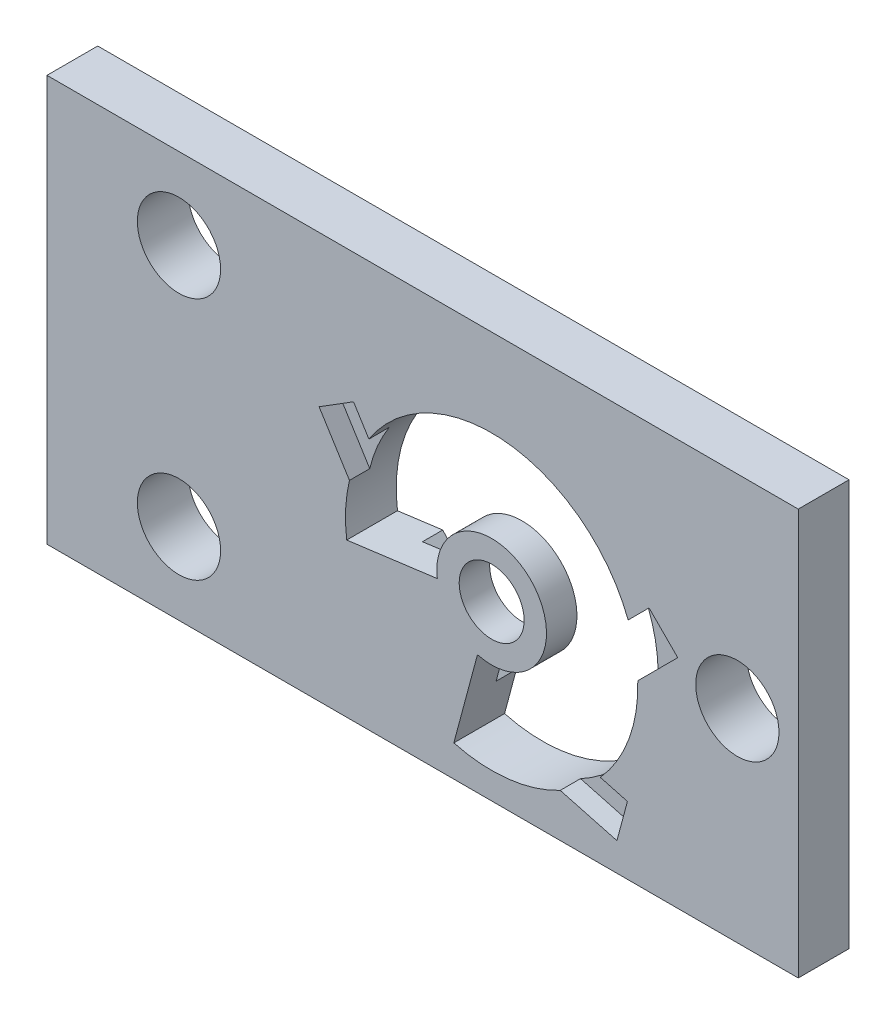
ISO-10303-21;
HEADER;
FILE_DESCRIPTION(('STEP AP214'),'2;1');
FILE_NAME('part.step','',(''),(''),'','','');
FILE_SCHEMA(('AUTOMOTIVE_DESIGN { 1 0 10303 214 1 1 1 1 }'));
ENDSEC;
DATA;
#1=APPLICATION_CONTEXT('core data for automotive mechanical design processes');
#2=APPLICATION_PROTOCOL_DEFINITION('international standard','automotive_design',2000,#1);
#3=PRODUCT_CONTEXT('',#1,'mechanical');
#4=PRODUCT('Part','Part','',(#3));
#5=PRODUCT_RELATED_PRODUCT_CATEGORY('part','',(#4));
#6=PRODUCT_DEFINITION_FORMATION('','',#4);
#7=PRODUCT_DEFINITION_CONTEXT('part definition',#1,'design');
#8=PRODUCT_DEFINITION('design','',#6,#7);
#9=PRODUCT_DEFINITION_SHAPE('','',#8);
#10=(LENGTH_UNIT() NAMED_UNIT(*) SI_UNIT(.MILLI.,.METRE.));
#11=(NAMED_UNIT(*) PLANE_ANGLE_UNIT() SI_UNIT($,.RADIAN.));
#12=(NAMED_UNIT(*) SI_UNIT($,.STERADIAN.) SOLID_ANGLE_UNIT());
#13=UNCERTAINTY_MEASURE_WITH_UNIT(LENGTH_MEASURE(1.E-05),#10,'distance_accuracy_value','');
#14=(GEOMETRIC_REPRESENTATION_CONTEXT(3) GLOBAL_UNCERTAINTY_ASSIGNED_CONTEXT((#13)) GLOBAL_UNIT_ASSIGNED_CONTEXT((#10,
#11,#12)) REPRESENTATION_CONTEXT('',''));
#15=CARTESIAN_POINT('',(0.,0.,0.));
#16=DIRECTION('',(0.,0.,1.));
#17=DIRECTION('',(1.,0.,0.));
#18=AXIS2_PLACEMENT_3D('',#15,#16,#17);
#19=CARTESIAN_POINT('',(3.4,-1.5,2.5));
#20=DIRECTION('',(0.,0.,-1.));
#21=DIRECTION('',(-1.,0.,0.));
#22=AXIS2_PLACEMENT_3D('',#19,#20,#21);
#23=CYLINDRICAL_SURFACE('',#22,1.6);
#24=CARTESIAN_POINT('',(3.4,-1.5,2.5));
#25=DIRECTION('',(0.,0.,1.));
#26=DIRECTION('',(1.,0.,0.));
#27=AXIS2_PLACEMENT_3D('',#24,#25,#26);
#28=CIRCLE('',#27,1.6);
#29=CARTESIAN_POINT('',(4.99999999999999,-1.5,2.5));
#30=VERTEX_POINT('',#29);
#31=EDGE_CURVE('E283',#30,#30,#28,.T.);
#32=ORIENTED_EDGE('',*,*,#31,.T.);
#33=EDGE_LOOP('',(#32));
#34=FACE_BOUND('',#33,.T.);
#35=CARTESIAN_POINT('',(3.4,-1.5,1.));
#36=DIRECTION('',(0.,0.,-1.));
#37=DIRECTION('',(-1.,0.,0.));
#38=AXIS2_PLACEMENT_3D('',#35,#36,#37);
#39=CIRCLE('',#38,1.6);
#40=CARTESIAN_POINT('',(1.79999999999999,-1.5,1.));
#41=VERTEX_POINT('',#40);
#42=EDGE_CURVE('E267',#41,#41,#39,.F.);
#43=ORIENTED_EDGE('',*,*,#42,.F.);
#44=EDGE_LOOP('',(#43));
#45=FACE_BOUND('',#44,.T.);
#46=ADVANCED_FACE('F34',(#34,#45),#23,.F.);
#47=CARTESIAN_POINT('',(3.4,-1.5,2.5));
#48=DIRECTION('',(0.,0.,-1.));
#49=DIRECTION('',(-1.,0.,0.));
#50=AXIS2_PLACEMENT_3D('',#47,#48,#49);
#51=CYLINDRICAL_SURFACE('',#50,2.7);
#52=CARTESIAN_POINT('',(3.4,-1.5,1.));
#53=DIRECTION('',(0.,0.,-1.));
#54=DIRECTION('',(-1.,0.,0.));
#55=AXIS2_PLACEMENT_3D('',#52,#53,#54);
#56=CIRCLE('',#55,2.7);
#57=CARTESIAN_POINT('',(0.72311131805391,-1.85251522586829,1.));
#58=VERTEX_POINT('',#57);
#59=CARTESIAN_POINT('',(2.70118857822319,-4.10799973098048,1.));
#60=VERTEX_POINT('',#59);
#61=EDGE_CURVE('E360',#58,#60,#56,.T.);
#62=ORIENTED_EDGE('',*,*,#61,.F.);
#63=DIRECTION('',(0.,0.,-1.));
#64=VECTOR('',#63,1.);
#65=CARTESIAN_POINT('',(0.72311131805391,-1.85251522586829,2.5));
#66=LINE('',#65,#64);
#67=CARTESIAN_POINT('',(0.72311131805391,-1.85251522586829,2.5));
#68=VERTEX_POINT('',#67);
#69=EDGE_CURVE('E349',#68,#58,#66,.T.);
#70=ORIENTED_EDGE('',*,*,#69,.F.);
#71=CARTESIAN_POINT('',(3.4,-1.5,2.5));
#72=DIRECTION('',(0.,0.,1.));
#73=DIRECTION('',(1.,0.,0.));
#74=AXIS2_PLACEMENT_3D('',#71,#72,#73);
#75=CIRCLE('',#74,2.7);
#76=CARTESIAN_POINT('',(2.70118857822319,-4.10799973098048,2.5));
#77=VERTEX_POINT('',#76);
#78=EDGE_CURVE('E318',#77,#68,#75,.T.);
#79=ORIENTED_EDGE('',*,*,#78,.F.);
#80=DIRECTION('',(0.,0.,-1.));
#81=VECTOR('',#80,1.);
#82=CARTESIAN_POINT('',(2.70118857822319,-4.10799973098048,2.5));
#83=LINE('',#82,#81);
#84=EDGE_CURVE('E352',#77,#60,#83,.T.);
#85=ORIENTED_EDGE('',*,*,#84,.T.);
#86=EDGE_LOOP('',(#62,#70,#79,#85));
#87=FACE_BOUND('',#86,.T.);
#88=ADVANCED_FACE('F407',(#87),#51,.T.);
#89=CARTESIAN_POINT('',(0.252122602840224,-1.91453898294296,2.5));
#90=DIRECTION('',(-0.130561194766033,0.991440252572623,0.));
#91=DIRECTION('',(-0.991440252572623,-0.130561194766033,0.));
#92=AXIS2_PLACEMENT_3D('',#89,#90,#91);
#93=PLANE('',#92);
#94=DIRECTION('',(0.,0.,-1.));
#95=VECTOR('',#94,1.);
#96=CARTESIAN_POINT('',(-1.50762925023449,-2.14627791409186,1.));
#97=LINE('',#96,#95);
#98=CARTESIAN_POINT('',(-1.50762925023449,-2.14627791409186,1.));
#99=VERTEX_POINT('',#98);
#100=CARTESIAN_POINT('',(-1.50762925023449,-2.14627791409186,0.));
#101=VERTEX_POINT('',#100);
#102=EDGE_CURVE('E272',#99,#101,#97,.T.);
#103=ORIENTED_EDGE('',*,*,#102,.T.);
#104=DIRECTION('',(0.991440252572623,0.130561194766033,0.));
#105=VECTOR('',#104,1.);
#106=CARTESIAN_POINT('',(0.252122602840224,-1.91453898294296,0.));
#107=LINE('',#106,#105);
#108=CARTESIAN_POINT('',(-3.73836981852289,-2.44004060231544,0.));
#109=VERTEX_POINT('',#108);
#110=EDGE_CURVE('E341',#109,#101,#107,.T.);
#111=ORIENTED_EDGE('',*,*,#110,.F.);
#112=DIRECTION('',(0.,0.,-1.));
#113=VECTOR('',#112,1.);
#114=CARTESIAN_POINT('',(-3.73836981852289,-2.44004060231544,2.5));
#115=LINE('',#114,#113);
#116=CARTESIAN_POINT('',(-3.73836981852289,-2.44004060231544,2.5));
#117=VERTEX_POINT('',#116);
#118=EDGE_CURVE('E358',#117,#109,#115,.T.);
#119=ORIENTED_EDGE('',*,*,#118,.F.);
#120=DIRECTION('',(0.991440252572623,0.130561194766033,0.));
#121=VECTOR('',#120,1.);
#122=CARTESIAN_POINT('',(0.252122602840224,-1.91453898294296,2.5));
#123=LINE('',#122,#121);
#124=EDGE_CURVE('E307',#117,#68,#123,.T.);
#125=ORIENTED_EDGE('',*,*,#124,.T.);
#126=ORIENTED_EDGE('',*,*,#69,.T.);
#127=DIRECTION('',(-0.991440252572623,-0.130561194766033,0.));
#128=VECTOR('',#127,1.);
#129=CARTESIAN_POINT('',(0.252122602840224,-1.91453898294296,1.));
#130=LINE('',#129,#128);
#131=EDGE_CURVE('E279',#58,#99,#130,.T.);
#132=ORIENTED_EDGE('',*,*,#131,.T.);
#133=EDGE_LOOP('',(#103,#111,#119,#125,#126,#132));
#134=FACE_BOUND('',#133,.T.);
#135=ADVANCED_FACE('F411',(#134),#93,.T.);
#136=CARTESIAN_POINT('',(3.4,-1.5,2.5));
#137=DIRECTION('',(0.,0.,-1.));
#138=DIRECTION('',(-1.,0.,0.));
#139=AXIS2_PLACEMENT_3D('',#136,#137,#138);
#140=CYLINDRICAL_SURFACE('',#139,7.2);
#141=CARTESIAN_POINT('',(3.4,-1.5,1.5));
#142=DIRECTION('',(0.,0.,1.));
#143=DIRECTION('',(1.,0.,0.));
#144=AXIS2_PLACEMENT_3D('',#141,#142,#143);
#145=CIRCLE('',#144,7.2);
#146=CARTESIAN_POINT('',(-3.60315234202061,0.172081718831754,1.5));
#147=VERTEX_POINT('',#146);
#148=CARTESIAN_POINT('',(-2.64448669175422,2.41205580650459,1.5));
#149=VERTEX_POINT('',#148);
#150=EDGE_CURVE('E11',#147,#149,#145,.F.);
#151=ORIENTED_EDGE('',*,*,#150,.F.);
#152=DIRECTION('',(0.,0.,-1.));
#153=VECTOR('',#152,1.);
#154=CARTESIAN_POINT('',(-3.60315234202061,0.172081718831753,2.5));
#155=LINE('',#154,#153);
#156=CARTESIAN_POINT('',(-3.60315234202061,0.172081718831755,2.5));
#157=VERTEX_POINT('',#156);
#158=EDGE_CURVE('E260',#147,#157,#155,.F.);
#159=ORIENTED_EDGE('',*,*,#158,.T.);
#160=CARTESIAN_POINT('',(3.4,-1.5,2.5));
#161=DIRECTION('',(0.,0.,1.));
#162=DIRECTION('',(1.,0.,0.));
#163=AXIS2_PLACEMENT_3D('',#160,#161,#162);
#164=CIRCLE('',#163,7.2);
#165=EDGE_CURVE('E311',#117,#157,#164,.F.);
#166=ORIENTED_EDGE('',*,*,#165,.F.);
#167=ORIENTED_EDGE('',*,*,#118,.T.);
#168=CARTESIAN_POINT('',(3.4,-1.5,0.));
#169=DIRECTION('',(0.,0.,1.));
#170=DIRECTION('',(1.,0.,0.));
#171=AXIS2_PLACEMENT_3D('',#168,#169,#170);
#172=CIRCLE('',#171,7.2);
#173=CARTESIAN_POINT('',(1.53650287526184,-8.45466594928129,0.));
#174=VERTEX_POINT('',#173);
#175=EDGE_CURVE('E344',#109,#174,#172,.F.);
#176=ORIENTED_EDGE('',*,*,#175,.T.);
#177=DIRECTION('',(0.,0.,-1.));
#178=VECTOR('',#177,1.);
#179=CARTESIAN_POINT('',(1.53650287526184,-8.45466594928129,2.5));
#180=LINE('',#179,#178);
#181=CARTESIAN_POINT('',(1.53650287526184,-8.45466594928129,2.5));
#182=VERTEX_POINT('',#181);
#183=EDGE_CURVE('E356',#182,#174,#180,.T.);
#184=ORIENTED_EDGE('',*,*,#183,.F.);
#185=CARTESIAN_POINT('',(6.77691834313488,-7.85896394893061,2.5));
#186=VERTEX_POINT('',#185);
#187=EDGE_CURVE('E310',#186,#182,#164,.F.);
#188=ORIENTED_EDGE('',*,*,#187,.F.);
#189=DIRECTION('',(0.,0.,-1.));
#190=VECTOR('',#189,1.);
#191=CARTESIAN_POINT('',(6.77691834313488,-7.85896394893061,2.5));
#192=LINE('',#191,#190);
#193=CARTESIAN_POINT('',(6.77691834313488,-7.85896394893061,1.5));
#194=VERTEX_POINT('',#193);
#195=EDGE_CURVE('E48',#186,#194,#192,.T.);
#196=ORIENTED_EDGE('',*,*,#195,.T.);
#197=CARTESIAN_POINT('',(3.4,-1.5,1.5));
#198=DIRECTION('',(0.,0.,1.));
#199=DIRECTION('',(1.,0.,0.));
#200=AXIS2_PLACEMENT_3D('',#197,#198,#199);
#201=CIRCLE('',#200,7.2);
#202=CARTESIAN_POINT('',(8.75098432516018,-6.31736097379987,1.5));
#203=VERTEX_POINT('',#202);
#204=EDGE_CURVE('E374',#203,#194,#201,.F.);
#205=ORIENTED_EDGE('',*,*,#204,.F.);
#206=DIRECTION('',(0.,0.,-1.));
#207=VECTOR('',#206,1.);
#208=CARTESIAN_POINT('',(8.75098432516018,-6.31736097379987,2.5));
#209=LINE('',#208,#207);
#210=CARTESIAN_POINT('',(8.75098432516018,-6.31736097379987,2.5));
#211=VERTEX_POINT('',#210);
#212=EDGE_CURVE('E251',#203,#211,#209,.F.);
#213=ORIENTED_EDGE('',*,*,#212,.T.);
#214=CARTESIAN_POINT('',(10.5964392409307,-1.27358831392241,2.5));
#215=VERTEX_POINT('',#214);
#216=EDGE_CURVE('E386',#215,#211,#164,.F.);
#217=ORIENTED_EDGE('',*,*,#216,.F.);
#218=DIRECTION('',(0.,0.,-1.));
#219=VECTOR('',#218,1.);
#220=CARTESIAN_POINT('',(10.5964392409307,-1.27358831392241,2.5));
#221=LINE('',#220,#219);
#222=CARTESIAN_POINT('',(10.5964392409307,-1.27358831392241,1.5));
#223=VERTEX_POINT('',#222);
#224=EDGE_CURVE('E56',#215,#223,#221,.T.);
#225=ORIENTED_EDGE('',*,*,#224,.T.);
#226=CARTESIAN_POINT('',(3.4,-1.5,1.5));
#227=DIRECTION('',(0.,0.,1.));
#228=DIRECTION('',(1.,0.,0.));
#229=AXIS2_PLACEMENT_3D('',#226,#227,#228);
#230=CIRCLE('',#229,7.2);
#231=CARTESIAN_POINT('',(10.121798652952,1.08019822284506,1.5));
#232=VERTEX_POINT('',#231);
#233=EDGE_CURVE('E41',#232,#223,#230,.F.);
#234=ORIENTED_EDGE('',*,*,#233,.F.);
#235=DIRECTION('',(0.,0.,-1.));
#236=VECTOR('',#235,1.);
#237=CARTESIAN_POINT('',(10.121798652952,1.08019822284506,2.5));
#238=LINE('',#237,#236);
#239=CARTESIAN_POINT('',(10.121798652952,1.08019822284506,2.5));
#240=VERTEX_POINT('',#239);
#241=EDGE_CURVE('E255',#232,#240,#238,.F.);
#242=ORIENTED_EDGE('',*,*,#241,.T.);
#243=CARTESIAN_POINT('',(-2.64448669175422,2.41205580650459,2.5));
#244=VERTEX_POINT('',#243);
#245=EDGE_CURVE('E315',#244,#240,#164,.F.);
#246=ORIENTED_EDGE('',*,*,#245,.F.);
#247=DIRECTION('',(0.,0.,-1.));
#248=VECTOR('',#247,1.);
#249=CARTESIAN_POINT('',(-2.64448669175422,2.41205580650459,2.5));
#250=LINE('',#249,#248);
#251=EDGE_CURVE('E258',#244,#149,#250,.T.);
#252=ORIENTED_EDGE('',*,*,#251,.T.);
#253=EDGE_LOOP('',(#151,#159,#166,#167,#176,#184,#188,#196,#205,#213,#217,#225,#234,#242,#246,#252));
#254=FACE_BOUND('',#253,.T.);
#255=ADVANCED_FACE('F384',(#254),#140,.F.);
#256=CARTESIAN_POINT('',(3.54724318643354,-0.95048094716167,2.5));
#257=DIRECTION('',(0.965925826289068,-0.258819045102521,0.));
#258=DIRECTION('',(0.258819045102521,0.965925826289068,0.));
#259=AXIS2_PLACEMENT_3D('',#256,#257,#258);
#260=PLANE('',#259);
#261=DIRECTION('',(0.,0.,-1.));
#262=VECTOR('',#261,1.);
#263=CARTESIAN_POINT('',(2.11884572674251,-6.28133284013089,1.));
#264=LINE('',#263,#262);
#265=CARTESIAN_POINT('',(2.11884572674251,-6.28133284013089,1.));
#266=VERTEX_POINT('',#265);
#267=CARTESIAN_POINT('',(2.11884572674251,-6.28133284013089,0.));
#268=VERTEX_POINT('',#267);
#269=EDGE_CURVE('E270',#266,#268,#264,.T.);
#270=ORIENTED_EDGE('',*,*,#269,.F.);
#271=DIRECTION('',(0.258819045102521,0.965925826289068,0.));
#272=VECTOR('',#271,1.);
#273=CARTESIAN_POINT('',(3.54724318643354,-0.95048094716167,1.));
#274=LINE('',#273,#272);
#275=EDGE_CURVE('E275',#266,#60,#274,.T.);
#276=ORIENTED_EDGE('',*,*,#275,.T.);
#277=ORIENTED_EDGE('',*,*,#84,.F.);
#278=DIRECTION('',(-0.258819045102521,-0.965925826289068,0.));
#279=VECTOR('',#278,1.);
#280=CARTESIAN_POINT('',(3.54724318643354,-0.95048094716167,2.5));
#281=LINE('',#280,#279);
#282=EDGE_CURVE('E314',#77,#182,#281,.T.);
#283=ORIENTED_EDGE('',*,*,#282,.T.);
#284=ORIENTED_EDGE('',*,*,#183,.T.);
#285=DIRECTION('',(-0.258819045102521,-0.965925826289068,0.));
#286=VECTOR('',#285,1.);
#287=CARTESIAN_POINT('',(3.54724318643354,-0.95048094716167,0.));
#288=LINE('',#287,#286);
#289=EDGE_CURVE('E287',#268,#174,#288,.T.);
#290=ORIENTED_EDGE('',*,*,#289,.F.);
#291=EDGE_LOOP('',(#270,#276,#277,#283,#284,#290));
#292=FACE_BOUND('',#291,.T.);
#293=ADVANCED_FACE('F402',(#292),#260,.T.);
#294=CARTESIAN_POINT('',(-18.5,0.,2.5));
#295=DIRECTION('',(-1.,0.,0.));
#296=DIRECTION('',(0.,0.,1.));
#297=AXIS2_PLACEMENT_3D('',#294,#295,#296);
#298=PLANE('',#297);
#299=DIRECTION('',(0.,1.,0.));
#300=VECTOR('',#299,1.);
#301=CARTESIAN_POINT('',(-18.5,0.,0.));
#302=LINE('',#301,#300);
#303=CARTESIAN_POINT('',(-18.5,-10.,0.));
#304=VERTEX_POINT('',#303);
#305=CARTESIAN_POINT('',(-18.5,10.,0.));
#306=VERTEX_POINT('',#305);
#307=EDGE_CURVE('E329',#304,#306,#302,.T.);
#308=ORIENTED_EDGE('',*,*,#307,.F.);
#309=DIRECTION('',(0.,0.,-1.));
#310=VECTOR('',#309,1.);
#311=CARTESIAN_POINT('',(-18.5,-10.,2.5));
#312=LINE('',#311,#310);
#313=CARTESIAN_POINT('',(-18.5,-10.,2.5));
#314=VERTEX_POINT('',#313);
#315=EDGE_CURVE('E353',#314,#304,#312,.T.);
#316=ORIENTED_EDGE('',*,*,#315,.F.);
#317=DIRECTION('',(0.,1.,0.));
#318=VECTOR('',#317,1.);
#319=CARTESIAN_POINT('',(-18.5,0.,2.5));
#320=LINE('',#319,#318);
#321=CARTESIAN_POINT('',(-18.5,10.,2.5));
#322=VERTEX_POINT('',#321);
#323=EDGE_CURVE('E296',#314,#322,#320,.T.);
#324=ORIENTED_EDGE('',*,*,#323,.T.);
#325=DIRECTION('',(0.,0.,-1.));
#326=VECTOR('',#325,1.);
#327=CARTESIAN_POINT('',(-18.5,10.,2.5));
#328=LINE('',#327,#326);
#329=EDGE_CURVE('E320',#322,#306,#328,.T.);
#330=ORIENTED_EDGE('',*,*,#329,.T.);
#331=EDGE_LOOP('',(#308,#316,#324,#330));
#332=FACE_BOUND('',#331,.T.);
#333=ADVANCED_FACE('F468',(#332),#298,.T.);
#334=CARTESIAN_POINT('',(0.,-10.,2.5));
#335=DIRECTION('',(0.,-1.,0.));
#336=DIRECTION('',(1.,0.,0.));
#337=AXIS2_PLACEMENT_3D('',#334,#335,#336);
#338=PLANE('',#337);
#339=DIRECTION('',(-1.,0.,0.));
#340=VECTOR('',#339,1.);
#341=CARTESIAN_POINT('',(0.,-10.,0.));
#342=LINE('',#341,#340);
#343=CARTESIAN_POINT('',(18.5,-10.,0.));
#344=VERTEX_POINT('',#343);
#345=EDGE_CURVE('E332',#344,#304,#342,.T.);
#346=ORIENTED_EDGE('',*,*,#345,.F.);
#347=DIRECTION('',(0.,0.,-1.));
#348=VECTOR('',#347,1.);
#349=CARTESIAN_POINT('',(18.5,-10.,2.5));
#350=LINE('',#349,#348);
#351=CARTESIAN_POINT('',(18.5,-10.,2.5));
#352=VERTEX_POINT('',#351);
#353=EDGE_CURVE('E365',#352,#344,#350,.T.);
#354=ORIENTED_EDGE('',*,*,#353,.F.);
#355=DIRECTION('',(-1.,0.,0.));
#356=VECTOR('',#355,1.);
#357=CARTESIAN_POINT('',(0.,-10.,2.5));
#358=LINE('',#357,#356);
#359=EDGE_CURVE('E299',#352,#314,#358,.T.);
#360=ORIENTED_EDGE('',*,*,#359,.T.);
#361=ORIENTED_EDGE('',*,*,#315,.T.);
#362=EDGE_LOOP('',(#346,#354,#360,#361));
#363=FACE_BOUND('',#362,.T.);
#364=ADVANCED_FACE('F481',(#363),#338,.T.);
#365=CARTESIAN_POINT('',(18.5,0.,2.5));
#366=DIRECTION('',(-1.,0.,0.));
#367=DIRECTION('',(0.,0.,1.));
#368=AXIS2_PLACEMENT_3D('',#365,#366,#367);
#369=PLANE('',#368);
#370=DIRECTION('',(0.,1.,0.));
#371=VECTOR('',#370,1.);
#372=CARTESIAN_POINT('',(18.5,0.,0.));
#373=LINE('',#372,#371);
#374=CARTESIAN_POINT('',(18.5,10.,0.));
#375=VERTEX_POINT('',#374);
#376=EDGE_CURVE('E335',#344,#375,#373,.T.);
#377=ORIENTED_EDGE('',*,*,#376,.T.);
#378=DIRECTION('',(0.,0.,-1.));
#379=VECTOR('',#378,1.);
#380=CARTESIAN_POINT('',(18.5,10.,2.5));
#381=LINE('',#380,#379);
#382=CARTESIAN_POINT('',(18.5,10.,2.5));
#383=VERTEX_POINT('',#382);
#384=EDGE_CURVE('E362',#383,#375,#381,.T.);
#385=ORIENTED_EDGE('',*,*,#384,.F.);
#386=DIRECTION('',(0.,1.,0.));
#387=VECTOR('',#386,1.);
#388=CARTESIAN_POINT('',(18.5,0.,2.5));
#389=LINE('',#388,#387);
#390=EDGE_CURVE('E302',#352,#383,#389,.T.);
#391=ORIENTED_EDGE('',*,*,#390,.F.);
#392=ORIENTED_EDGE('',*,*,#353,.T.);
#393=EDGE_LOOP('',(#377,#385,#391,#392));
#394=FACE_BOUND('',#393,.T.);
#395=ADVANCED_FACE('F477',(#394),#369,.F.);
#396=CARTESIAN_POINT('',(0.,10.,2.5));
#397=DIRECTION('',(0.,-1.,0.));
#398=DIRECTION('',(1.,0.,0.));
#399=AXIS2_PLACEMENT_3D('',#396,#397,#398);
#400=PLANE('',#399);
#401=DIRECTION('',(-1.,0.,0.));
#402=VECTOR('',#401,1.);
#403=CARTESIAN_POINT('',(0.,10.,0.));
#404=LINE('',#403,#402);
#405=EDGE_CURVE('E338',#375,#306,#404,.T.);
#406=ORIENTED_EDGE('',*,*,#405,.T.);
#407=ORIENTED_EDGE('',*,*,#329,.F.);
#408=DIRECTION('',(-1.,0.,0.));
#409=VECTOR('',#408,1.);
#410=CARTESIAN_POINT('',(0.,10.,2.5));
#411=LINE('',#410,#409);
#412=EDGE_CURVE('E305',#383,#322,#411,.T.);
#413=ORIENTED_EDGE('',*,*,#412,.F.);
#414=ORIENTED_EDGE('',*,*,#384,.T.);
#415=EDGE_LOOP('',(#406,#407,#413,#414));
#416=FACE_BOUND('',#415,.T.);
#417=ADVANCED_FACE('F473',(#416),#400,.F.);
#418=CARTESIAN_POINT('',(-12.,6.,2.5));
#419=DIRECTION('',(0.,0.,-1.));
#420=DIRECTION('',(-1.,0.,0.));
#421=AXIS2_PLACEMENT_3D('',#418,#419,#420);
#422=CYLINDRICAL_SURFACE('',#421,2.05);
#423=CARTESIAN_POINT('',(-12.,6.,2.5));
#424=DIRECTION('',(0.,0.,1.));
#425=DIRECTION('',(1.,0.,0.));
#426=AXIS2_PLACEMENT_3D('',#423,#424,#425);
#427=CIRCLE('',#426,2.05);
#428=CARTESIAN_POINT('',(-9.95,6.,2.5));
#429=VERTEX_POINT('',#428);
#430=EDGE_CURVE('E293',#429,#429,#427,.T.);
#431=ORIENTED_EDGE('',*,*,#430,.T.);
#432=EDGE_LOOP('',(#431));
#433=FACE_BOUND('',#432,.T.);
#434=CARTESIAN_POINT('',(-12.,6.,0.));
#435=DIRECTION('',(0.,0.,1.));
#436=DIRECTION('',(1.,0.,0.));
#437=AXIS2_PLACEMENT_3D('',#434,#435,#436);
#438=CIRCLE('',#437,2.05);
#439=CARTESIAN_POINT('',(-9.95,6.,0.));
#440=VERTEX_POINT('',#439);
#441=EDGE_CURVE('E326',#440,#440,#438,.T.);
#442=ORIENTED_EDGE('',*,*,#441,.F.);
#443=EDGE_LOOP('',(#442));
#444=FACE_BOUND('',#443,.T.);
#445=ADVANCED_FACE('F476',(#433,#444),#422,.F.);
#446=CARTESIAN_POINT('',(-12.,-6.,2.5));
#447=DIRECTION('',(0.,0.,-1.));
#448=DIRECTION('',(-1.,0.,0.));
#449=AXIS2_PLACEMENT_3D('',#446,#447,#448);
#450=CYLINDRICAL_SURFACE('',#449,2.05);
#451=CARTESIAN_POINT('',(-12.,-6.,2.5));
#452=DIRECTION('',(0.,0.,1.));
#453=DIRECTION('',(1.,0.,0.));
#454=AXIS2_PLACEMENT_3D('',#451,#452,#453);
#455=CIRCLE('',#454,2.05);
#456=CARTESIAN_POINT('',(-9.95,-6.,2.5));
#457=VERTEX_POINT('',#456);
#458=EDGE_CURVE('E290',#457,#457,#455,.T.);
#459=ORIENTED_EDGE('',*,*,#458,.T.);
#460=EDGE_LOOP('',(#459));
#461=FACE_BOUND('',#460,.T.);
#462=CARTESIAN_POINT('',(-12.,-6.,0.));
#463=DIRECTION('',(0.,0.,1.));
#464=DIRECTION('',(1.,0.,0.));
#465=AXIS2_PLACEMENT_3D('',#462,#463,#464);
#466=CIRCLE('',#465,2.05);
#467=CARTESIAN_POINT('',(-9.95,-6.,0.));
#468=VERTEX_POINT('',#467);
#469=EDGE_CURVE('E323',#468,#468,#466,.T.);
#470=ORIENTED_EDGE('',*,*,#469,.F.);
#471=EDGE_LOOP('',(#470));
#472=FACE_BOUND('',#471,.T.);
#473=ADVANCED_FACE('F491',(#461,#472),#450,.F.);
#474=CARTESIAN_POINT('',(15.5,0.,2.5));
#475=DIRECTION('',(0.,0.,-1.));
#476=DIRECTION('',(-1.,0.,0.));
#477=AXIS2_PLACEMENT_3D('',#474,#475,#476);
#478=CYLINDRICAL_SURFACE('',#477,2.05);
#479=CARTESIAN_POINT('',(15.5,0.,2.5));
#480=DIRECTION('',(0.,0.,1.));
#481=DIRECTION('',(1.,0.,0.));
#482=AXIS2_PLACEMENT_3D('',#479,#480,#481);
#483=CIRCLE('',#482,2.05);
#484=CARTESIAN_POINT('',(17.55,0.,2.5));
#485=VERTEX_POINT('',#484);
#486=EDGE_CURVE('E286',#485,#485,#483,.T.);
#487=ORIENTED_EDGE('',*,*,#486,.T.);
#488=EDGE_LOOP('',(#487));
#489=FACE_BOUND('',#488,.T.);
#490=CARTESIAN_POINT('',(15.5,0.,0.));
#491=DIRECTION('',(0.,0.,1.));
#492=DIRECTION('',(1.,0.,0.));
#493=AXIS2_PLACEMENT_3D('',#490,#491,#492);
#494=CIRCLE('',#493,2.05);
#495=CARTESIAN_POINT('',(17.55,0.,0.));
#496=VERTEX_POINT('',#495);
#497=EDGE_CURVE('E282',#496,#496,#494,.T.);
#498=ORIENTED_EDGE('',*,*,#497,.F.);
#499=EDGE_LOOP('',(#498));
#500=FACE_BOUND('',#499,.T.);
#501=ADVANCED_FACE('F462',(#489,#500),#478,.F.);
#502=CARTESIAN_POINT('',(0.,0.,2.5));
#503=DIRECTION('',(0.,0.,1.));
#504=DIRECTION('',(1.,0.,0.));
#505=AXIS2_PLACEMENT_3D('',#502,#503,#504);
#506=PLANE('',#505);
#507=DIRECTION('',(0.5299192642332,-0.848048096156429,0.));
#508=VECTOR('',#507,1.);
#509=CARTESIAN_POINT('',(-5.09849282403259,2.56512672486845,2.5));
#510=LINE('',#509,#508);
#511=CARTESIAN_POINT('',(-5.09849282403259,2.56512672486845,2.5));
#512=VERTEX_POINT('',#511);
#513=EDGE_CURVE('E209',#512,#157,#510,.T.);
#514=ORIENTED_EDGE('',*,*,#513,.F.);
#515=DIRECTION('',(-0.848048096156429,-0.5299192642332,0.));
#516=VECTOR('',#515,1.);
#517=CARTESIAN_POINT('',(-5.09849282403259,2.56512672486845,2.5));
#518=LINE('',#517,#516);
#519=CARTESIAN_POINT('',(-3.40239663171973,3.62496525333485,2.5));
#520=VERTEX_POINT('',#519);
#521=EDGE_CURVE('E211',#520,#512,#518,.T.);
#522=ORIENTED_EDGE('',*,*,#521,.F.);
#523=DIRECTION('',(-0.5299192642332,0.848048096156429,0.));
#524=VECTOR('',#523,1.);
#525=CARTESIAN_POINT('',(-0.817905978629673,-0.511084378789082,2.5));
#526=LINE('',#525,#524);
#527=EDGE_CURVE('E198',#244,#520,#526,.T.);
#528=ORIENTED_EDGE('',*,*,#527,.F.);
#529=ORIENTED_EDGE('',*,*,#245,.T.);
#530=DIRECTION('',(-0.707106781186544,-0.707106781186551,0.));
#531=VECTOR('',#530,1.);
#532=CARTESIAN_POINT('',(11.1515384428001,2.10993801269317,2.5));
#533=LINE('',#532,#531);
#534=CARTESIAN_POINT('',(11.1515384428001,2.10993801269317,2.5));
#535=VERTEX_POINT('',#534);
#536=EDGE_CURVE('E225',#535,#240,#533,.T.);
#537=ORIENTED_EDGE('',*,*,#536,.F.);
#538=DIRECTION('',(-0.707106781186552,0.707106781186544,0.));
#539=VECTOR('',#538,1.);
#540=CARTESIAN_POINT('',(11.1515384428001,2.10993801269317,2.5));
#541=LINE('',#540,#539);
#542=CARTESIAN_POINT('',(12.5657520051732,0.695724450320085,2.5));
#543=VERTEX_POINT('',#542);
#544=EDGE_CURVE('E219',#543,#535,#541,.T.);
#545=ORIENTED_EDGE('',*,*,#544,.F.);
#546=DIRECTION('',(0.707106781186543,0.707106781186552,0.));
#547=VECTOR('',#546,1.);
#548=CARTESIAN_POINT('',(5.93501377742663,-5.93501377742656,2.5));
#549=LINE('',#548,#547);
#550=EDGE_CURVE('E371',#215,#543,#549,.T.);
#551=ORIENTED_EDGE('',*,*,#550,.F.);
#552=ORIENTED_EDGE('',*,*,#216,.T.);
#553=DIRECTION('',(-0.965925826289069,0.258819045102518,0.));
#554=VECTOR('',#553,1.);
#555=CARTESIAN_POINT('',(10.0868146232102,-6.67529562338739,2.5));
#556=LINE('',#555,#554);
#557=CARTESIAN_POINT('',(10.0868146232102,-6.67529562338739,2.5));
#558=VERTEX_POINT('',#557);
#559=EDGE_CURVE('E243',#558,#211,#556,.T.);
#560=ORIENTED_EDGE('',*,*,#559,.F.);
#561=DIRECTION('',(0.258819045102518,0.965925826289069,0.));
#562=VECTOR('',#561,1.);
#563=CARTESIAN_POINT('',(10.0868146232102,-6.67529562338739,2.5));
#564=LINE('',#563,#562);
#565=CARTESIAN_POINT('',(9.56917653300515,-8.60714727596553,2.5));
#566=VERTEX_POINT('',#565);
#567=EDGE_CURVE('E237',#566,#558,#564,.T.);
#568=ORIENTED_EDGE('',*,*,#567,.F.);
#569=DIRECTION('',(0.965925826289069,-0.258819045102518,0.));
#570=VECTOR('',#569,1.);
#571=CARTESIAN_POINT('',(-1.51077353792898,-5.63828360228161,2.5));
#572=LINE('',#571,#570);
#573=EDGE_CURVE('E369',#186,#566,#572,.T.);
#574=ORIENTED_EDGE('',*,*,#573,.F.);
#575=ORIENTED_EDGE('',*,*,#187,.T.);
#576=ORIENTED_EDGE('',*,*,#282,.F.);
#577=ORIENTED_EDGE('',*,*,#78,.T.);
#578=ORIENTED_EDGE('',*,*,#124,.F.);
#579=ORIENTED_EDGE('',*,*,#165,.T.);
#580=EDGE_LOOP('',(#514,#522,#528,#529,#537,#545,#551,#552,#560,#568,#574,#575,#576,#577,#578,#579));
#581=FACE_BOUND('',#580,.T.);
#582=ORIENTED_EDGE('',*,*,#31,.F.);
#583=EDGE_LOOP('',(#582));
#584=FACE_BOUND('',#583,.T.);
#585=ORIENTED_EDGE('',*,*,#486,.F.);
#586=EDGE_LOOP('',(#585));
#587=FACE_BOUND('',#586,.T.);
#588=ORIENTED_EDGE('',*,*,#458,.F.);
#589=EDGE_LOOP('',(#588));
#590=FACE_BOUND('',#589,.T.);
#591=ORIENTED_EDGE('',*,*,#430,.F.);
#592=EDGE_LOOP('',(#591));
#593=FACE_BOUND('',#592,.T.);
#594=ORIENTED_EDGE('',*,*,#323,.F.);
#595=ORIENTED_EDGE('',*,*,#359,.F.);
#596=ORIENTED_EDGE('',*,*,#390,.T.);
#597=ORIENTED_EDGE('',*,*,#412,.T.);
#598=EDGE_LOOP('',(#594,#595,#596,#597));
#599=FACE_BOUND('',#598,.T.);
#600=ADVANCED_FACE('F395',(#581,#584,#587,#590,#593,#599),#506,.T.);
#601=CARTESIAN_POINT('',(0.,0.,0.));
#602=DIRECTION('',(0.,0.,1.));
#603=DIRECTION('',(1.,0.,0.));
#604=AXIS2_PLACEMENT_3D('',#601,#602,#603);
#605=PLANE('',#604);
#606=ORIENTED_EDGE('',*,*,#497,.T.);
#607=EDGE_LOOP('',(#606));
#608=FACE_BOUND('',#607,.T.);
#609=ORIENTED_EDGE('',*,*,#469,.T.);
#610=EDGE_LOOP('',(#609));
#611=FACE_BOUND('',#610,.T.);
#612=ORIENTED_EDGE('',*,*,#441,.T.);
#613=EDGE_LOOP('',(#612));
#614=FACE_BOUND('',#613,.T.);
#615=ORIENTED_EDGE('',*,*,#307,.T.);
#616=ORIENTED_EDGE('',*,*,#405,.F.);
#617=ORIENTED_EDGE('',*,*,#376,.F.);
#618=ORIENTED_EDGE('',*,*,#345,.T.);
#619=EDGE_LOOP('',(#615,#616,#617,#618));
#620=FACE_BOUND('',#619,.T.);
#621=ORIENTED_EDGE('',*,*,#110,.T.);
#622=DIRECTION('',(-0.659359086723092,0.751828168370732,0.));
#623=VECTOR('',#622,1.);
#624=CARTESIAN_POINT('',(-1.91614384128107,-1.68047288778113,0.));
#625=LINE('',#624,#623);
#626=EDGE_CURVE('E263',#268,#101,#625,.T.);
#627=ORIENTED_EDGE('',*,*,#626,.F.);
#628=ORIENTED_EDGE('',*,*,#289,.T.);
#629=ORIENTED_EDGE('',*,*,#175,.F.);
#630=EDGE_LOOP('',(#621,#627,#628,#629));
#631=FACE_BOUND('',#630,.T.);
#632=ADVANCED_FACE('F454',(#608,#611,#614,#620,#631),#605,.F.);
#633=CARTESIAN_POINT('',(-1.91614384128107,-1.68047288778113,1.));
#634=DIRECTION('',(-0.751828168370732,-0.659359086723092,0.));
#635=DIRECTION('',(0.659359086723092,-0.751828168370732,0.));
#636=AXIS2_PLACEMENT_3D('',#633,#634,#635);
#637=PLANE('',#636);
#638=ORIENTED_EDGE('',*,*,#626,.T.);
#639=ORIENTED_EDGE('',*,*,#102,.F.);
#640=DIRECTION('',(-0.659359086723092,0.751828168370732,0.));
#641=VECTOR('',#640,1.);
#642=CARTESIAN_POINT('',(-1.91614384128107,-1.68047288778113,1.));
#643=LINE('',#642,#641);
#644=EDGE_CURVE('E264',#266,#99,#643,.T.);
#645=ORIENTED_EDGE('',*,*,#644,.F.);
#646=ORIENTED_EDGE('',*,*,#269,.T.);
#647=EDGE_LOOP('',(#638,#639,#645,#646));
#648=FACE_BOUND('',#647,.T.);
#649=ADVANCED_FACE('F444',(#648),#637,.F.);
#650=CARTESIAN_POINT('',(0.,0.,1.));
#651=DIRECTION('',(0.,0.,-1.));
#652=DIRECTION('',(-1.,0.,0.));
#653=AXIS2_PLACEMENT_3D('',#650,#651,#652);
#654=PLANE('',#653);
#655=ORIENTED_EDGE('',*,*,#61,.T.);
#656=ORIENTED_EDGE('',*,*,#275,.F.);
#657=ORIENTED_EDGE('',*,*,#644,.T.);
#658=ORIENTED_EDGE('',*,*,#131,.F.);
#659=EDGE_LOOP('',(#655,#656,#657,#658));
#660=FACE_BOUND('',#659,.T.);
#661=ORIENTED_EDGE('',*,*,#42,.T.);
#662=EDGE_LOOP('',(#661));
#663=FACE_BOUND('',#662,.T.);
#664=ADVANCED_FACE('F441',(#660,#663),#654,.T.);
#665=CARTESIAN_POINT('',(0.,0.,1.5));
#666=DIRECTION('',(0.,0.,1.));
#667=DIRECTION('',(1.,0.,0.));
#668=AXIS2_PLACEMENT_3D('',#665,#666,#667);
#669=PLANE('',#668);
#670=ORIENTED_EDGE('',*,*,#204,.T.);
#671=DIRECTION('',(0.965925826289069,-0.258819045102518,0.));
#672=VECTOR('',#671,1.);
#673=CARTESIAN_POINT('',(9.56917653300515,-8.60714727596553,1.5));
#674=LINE('',#673,#672);
#675=CARTESIAN_POINT('',(9.56917653300515,-8.60714727596553,1.5));
#676=VERTEX_POINT('',#675);
#677=EDGE_CURVE('E236',#194,#676,#674,.T.);
#678=ORIENTED_EDGE('',*,*,#677,.T.);
#679=DIRECTION('',(0.258819045102518,0.965925826289069,0.));
#680=VECTOR('',#679,1.);
#681=CARTESIAN_POINT('',(10.0868146232102,-6.67529562338739,1.5));
#682=LINE('',#681,#680);
#683=CARTESIAN_POINT('',(10.0868146232102,-6.67529562338739,1.5));
#684=VERTEX_POINT('',#683);
#685=EDGE_CURVE('E239',#676,#684,#682,.T.);
#686=ORIENTED_EDGE('',*,*,#685,.T.);
#687=DIRECTION('',(-0.965925826289069,0.258819045102518,0.));
#688=VECTOR('',#687,1.);
#689=CARTESIAN_POINT('',(10.0868146232102,-6.67529562338739,1.5));
#690=LINE('',#689,#688);
#691=EDGE_CURVE('E233',#684,#203,#690,.T.);
#692=ORIENTED_EDGE('',*,*,#691,.T.);
#693=EDGE_LOOP('',(#670,#678,#686,#692));
#694=FACE_BOUND('',#693,.T.);
#695=ADVANCED_FACE('F443',(#694),#669,.T.);
#696=CARTESIAN_POINT('',(10.0868146232102,-6.67529562338739,1.5));
#697=DIRECTION('',(0.258819045102518,0.965925826289069,0.));
#698=DIRECTION('',(-0.965925826289069,0.258819045102518,0.));
#699=AXIS2_PLACEMENT_3D('',#696,#697,#698);
#700=PLANE('',#699);
#701=ORIENTED_EDGE('',*,*,#691,.F.);
#702=DIRECTION('',(0.,0.,1.));
#703=VECTOR('',#702,1.);
#704=CARTESIAN_POINT('',(10.0868146232102,-6.67529562338739,1.5));
#705=LINE('',#704,#703);
#706=EDGE_CURVE('E227',#684,#558,#705,.T.);
#707=ORIENTED_EDGE('',*,*,#706,.T.);
#708=ORIENTED_EDGE('',*,*,#559,.T.);
#709=ORIENTED_EDGE('',*,*,#212,.F.);
#710=EDGE_LOOP('',(#701,#707,#708,#709));
#711=FACE_BOUND('',#710,.T.);
#712=ADVANCED_FACE('F451',(#711),#700,.F.);
#713=CARTESIAN_POINT('',(9.56917653300515,-8.60714727596553,1.5));
#714=DIRECTION('',(-0.258819045102518,-0.965925826289069,0.));
#715=DIRECTION('',(0.965925826289069,-0.258819045102518,0.));
#716=AXIS2_PLACEMENT_3D('',#713,#714,#715);
#717=PLANE('',#716);
#718=ORIENTED_EDGE('',*,*,#573,.T.);
#719=DIRECTION('',(0.,0.,1.));
#720=VECTOR('',#719,1.);
#721=CARTESIAN_POINT('',(9.56917653300515,-8.60714727596553,1.5));
#722=LINE('',#721,#720);
#723=EDGE_CURVE('E242',#676,#566,#722,.T.);
#724=ORIENTED_EDGE('',*,*,#723,.F.);
#725=ORIENTED_EDGE('',*,*,#677,.F.);
#726=ORIENTED_EDGE('',*,*,#195,.F.);
#727=EDGE_LOOP('',(#718,#724,#725,#726));
#728=FACE_BOUND('',#727,.T.);
#729=ADVANCED_FACE('F630',(#728),#717,.F.);
#730=CARTESIAN_POINT('',(10.0868146232102,-6.67529562338739,1.5));
#731=DIRECTION('',(0.965925826289069,-0.258819045102518,0.));
#732=DIRECTION('',(0.258819045102518,0.965925826289069,0.));
#733=AXIS2_PLACEMENT_3D('',#730,#731,#732);
#734=PLANE('',#733);
#735=ORIENTED_EDGE('',*,*,#567,.T.);
#736=ORIENTED_EDGE('',*,*,#706,.F.);
#737=ORIENTED_EDGE('',*,*,#685,.F.);
#738=ORIENTED_EDGE('',*,*,#723,.T.);
#739=EDGE_LOOP('',(#735,#736,#737,#738));
#740=FACE_BOUND('',#739,.T.);
#741=ADVANCED_FACE('F638',(#740),#734,.F.);
#742=CARTESIAN_POINT('',(0.,0.,1.5));
#743=DIRECTION('',(0.,0.,1.));
#744=DIRECTION('',(1.,0.,0.));
#745=AXIS2_PLACEMENT_3D('',#742,#743,#744);
#746=PLANE('',#745);
#747=ORIENTED_EDGE('',*,*,#233,.T.);
#748=DIRECTION('',(0.707106781186543,0.707106781186552,0.));
#749=VECTOR('',#748,1.);
#750=CARTESIAN_POINT('',(12.5657520051732,0.695724450320085,1.5));
#751=LINE('',#750,#749);
#752=CARTESIAN_POINT('',(12.5657520051732,0.695724450320085,1.5));
#753=VERTEX_POINT('',#752);
#754=EDGE_CURVE('E218',#223,#753,#751,.T.);
#755=ORIENTED_EDGE('',*,*,#754,.T.);
#756=DIRECTION('',(-0.707106781186552,0.707106781186544,0.));
#757=VECTOR('',#756,1.);
#758=CARTESIAN_POINT('',(11.1515384428001,2.10993801269317,1.5));
#759=LINE('',#758,#757);
#760=CARTESIAN_POINT('',(11.1515384428001,2.10993801269317,1.5));
#761=VERTEX_POINT('',#760);
#762=EDGE_CURVE('E221',#753,#761,#759,.T.);
#763=ORIENTED_EDGE('',*,*,#762,.T.);
#764=DIRECTION('',(-0.707106781186544,-0.707106781186551,0.));
#765=VECTOR('',#764,1.);
#766=CARTESIAN_POINT('',(11.1515384428001,2.10993801269317,1.5));
#767=LINE('',#766,#765);
#768=EDGE_CURVE('E215',#761,#232,#767,.T.);
#769=ORIENTED_EDGE('',*,*,#768,.T.);
#770=EDGE_LOOP('',(#747,#755,#763,#769));
#771=FACE_BOUND('',#770,.T.);
#772=ADVANCED_FACE('F377',(#771),#746,.T.);
#773=CARTESIAN_POINT('',(11.1515384428001,2.10993801269317,1.5));
#774=DIRECTION('',(-0.707106781186551,0.707106781186544,0.));
#775=DIRECTION('',(-0.707106781186544,-0.707106781186551,0.));
#776=AXIS2_PLACEMENT_3D('',#773,#774,#775);
#777=PLANE('',#776);
#778=ORIENTED_EDGE('',*,*,#768,.F.);
#779=DIRECTION('',(0.,0.,1.));
#780=VECTOR('',#779,1.);
#781=CARTESIAN_POINT('',(11.1515384428001,2.10993801269317,1.5));
#782=LINE('',#781,#780);
#783=EDGE_CURVE('E212',#761,#535,#782,.T.);
#784=ORIENTED_EDGE('',*,*,#783,.T.);
#785=ORIENTED_EDGE('',*,*,#536,.T.);
#786=ORIENTED_EDGE('',*,*,#241,.F.);
#787=EDGE_LOOP('',(#778,#784,#785,#786));
#788=FACE_BOUND('',#787,.T.);
#789=ADVANCED_FACE('F418',(#788),#777,.F.);
#790=CARTESIAN_POINT('',(12.5657520051732,0.695724450320085,1.5));
#791=DIRECTION('',(0.707106781186552,-0.707106781186543,0.));
#792=DIRECTION('',(0.707106781186543,0.707106781186552,0.));
#793=AXIS2_PLACEMENT_3D('',#790,#791,#792);
#794=PLANE('',#793);
#795=ORIENTED_EDGE('',*,*,#550,.T.);
#796=DIRECTION('',(0.,0.,1.));
#797=VECTOR('',#796,1.);
#798=CARTESIAN_POINT('',(12.5657520051732,0.695724450320085,1.5));
#799=LINE('',#798,#797);
#800=EDGE_CURVE('E224',#753,#543,#799,.T.);
#801=ORIENTED_EDGE('',*,*,#800,.F.);
#802=ORIENTED_EDGE('',*,*,#754,.F.);
#803=ORIENTED_EDGE('',*,*,#224,.F.);
#804=EDGE_LOOP('',(#795,#801,#802,#803));
#805=FACE_BOUND('',#804,.T.);
#806=ADVANCED_FACE('F381',(#805),#794,.F.);
#807=CARTESIAN_POINT('',(11.1515384428001,2.10993801269317,1.5));
#808=DIRECTION('',(0.707106781186543,0.707106781186552,0.));
#809=DIRECTION('',(-0.707106781186552,0.707106781186543,0.));
#810=AXIS2_PLACEMENT_3D('',#807,#808,#809);
#811=PLANE('',#810);
#812=ORIENTED_EDGE('',*,*,#544,.T.);
#813=ORIENTED_EDGE('',*,*,#783,.F.);
#814=ORIENTED_EDGE('',*,*,#762,.F.);
#815=ORIENTED_EDGE('',*,*,#800,.T.);
#816=EDGE_LOOP('',(#812,#813,#814,#815));
#817=FACE_BOUND('',#816,.T.);
#818=ADVANCED_FACE('F421',(#817),#811,.F.);
#819=CARTESIAN_POINT('',(0.,0.,1.5));
#820=DIRECTION('',(0.,0.,1.));
#821=DIRECTION('',(1.,0.,0.));
#822=AXIS2_PLACEMENT_3D('',#819,#820,#821);
#823=PLANE('',#822);
#824=ORIENTED_EDGE('',*,*,#150,.T.);
#825=DIRECTION('',(-0.5299192642332,0.848048096156429,0.));
#826=VECTOR('',#825,1.);
#827=CARTESIAN_POINT('',(-3.40239663171973,3.62496525333485,1.5));
#828=LINE('',#827,#826);
#829=CARTESIAN_POINT('',(-3.40239663171973,3.62496525333485,1.5));
#830=VERTEX_POINT('',#829);
#831=EDGE_CURVE('E183',#149,#830,#828,.T.);
#832=ORIENTED_EDGE('',*,*,#831,.T.);
#833=DIRECTION('',(-0.848048096156429,-0.5299192642332,0.));
#834=VECTOR('',#833,1.);
#835=CARTESIAN_POINT('',(-5.09849282403259,2.56512672486845,1.5));
#836=LINE('',#835,#834);
#837=CARTESIAN_POINT('',(-5.09849282403259,2.56512672486845,1.5));
#838=VERTEX_POINT('',#837);
#839=EDGE_CURVE('E188',#830,#838,#836,.T.);
#840=ORIENTED_EDGE('',*,*,#839,.T.);
#841=DIRECTION('',(0.5299192642332,-0.848048096156429,0.));
#842=VECTOR('',#841,1.);
#843=CARTESIAN_POINT('',(-5.09849282403259,2.56512672486845,1.5));
#844=LINE('',#843,#842);
#845=EDGE_CURVE('E192',#838,#147,#844,.T.);
#846=ORIENTED_EDGE('',*,*,#845,.T.);
#847=EDGE_LOOP('',(#824,#832,#840,#846));
#848=FACE_BOUND('',#847,.T.);
#849=ADVANCED_FACE('F185',(#848),#823,.T.);
#850=CARTESIAN_POINT('',(-5.09849282403259,2.56512672486845,1.5));
#851=DIRECTION('',(-0.848048096156429,-0.5299192642332,0.));
#852=DIRECTION('',(0.5299192642332,-0.848048096156429,0.));
#853=AXIS2_PLACEMENT_3D('',#850,#851,#852);
#854=PLANE('',#853);
#855=ORIENTED_EDGE('',*,*,#845,.F.);
#856=DIRECTION('',(0.,0.,1.));
#857=VECTOR('',#856,1.);
#858=CARTESIAN_POINT('',(-5.09849282403259,2.56512672486845,1.5));
#859=LINE('',#858,#857);
#860=EDGE_CURVE('E202',#838,#512,#859,.T.);
#861=ORIENTED_EDGE('',*,*,#860,.T.);
#862=ORIENTED_EDGE('',*,*,#513,.T.);
#863=ORIENTED_EDGE('',*,*,#158,.F.);
#864=EDGE_LOOP('',(#855,#861,#862,#863));
#865=FACE_BOUND('',#864,.T.);
#866=ADVANCED_FACE('F414',(#865),#854,.F.);
#867=CARTESIAN_POINT('',(-3.40239663171973,3.62496525333485,1.5));
#868=DIRECTION('',(0.848048096156429,0.5299192642332,0.));
#869=DIRECTION('',(-0.5299192642332,0.848048096156429,0.));
#870=AXIS2_PLACEMENT_3D('',#867,#868,#869);
#871=PLANE('',#870);
#872=ORIENTED_EDGE('',*,*,#527,.T.);
#873=DIRECTION('',(0.,0.,1.));
#874=VECTOR('',#873,1.);
#875=CARTESIAN_POINT('',(-3.40239663171973,3.62496525333485,1.5));
#876=LINE('',#875,#874);
#877=EDGE_CURVE('E195',#830,#520,#876,.T.);
#878=ORIENTED_EDGE('',*,*,#877,.F.);
#879=ORIENTED_EDGE('',*,*,#831,.F.);
#880=ORIENTED_EDGE('',*,*,#251,.F.);
#881=EDGE_LOOP('',(#872,#878,#879,#880));
#882=FACE_BOUND('',#881,.T.);
#883=ADVANCED_FACE('F196',(#882),#871,.F.);
#884=CARTESIAN_POINT('',(-5.09849282403259,2.56512672486845,1.5));
#885=DIRECTION('',(-0.5299192642332,0.848048096156429,0.));
#886=DIRECTION('',(-0.848048096156429,-0.5299192642332,0.));
#887=AXIS2_PLACEMENT_3D('',#884,#885,#886);
#888=PLANE('',#887);
#889=ORIENTED_EDGE('',*,*,#521,.T.);
#890=ORIENTED_EDGE('',*,*,#860,.F.);
#891=ORIENTED_EDGE('',*,*,#839,.F.);
#892=ORIENTED_EDGE('',*,*,#877,.T.);
#893=EDGE_LOOP('',(#889,#890,#891,#892));
#894=FACE_BOUND('',#893,.T.);
#895=ADVANCED_FACE('F204',(#894),#888,.F.);
#896=CLOSED_SHELL('',(#46,#88,#135,#255,#293,#333,#364,#395,#417,#445,#473,#501,#600,#632,#649,
#664,#695,#712,#729,#741,#772,#789,#806,#818,#849,#866,#883,#895));
#897=MANIFOLD_SOLID_BREP('B2',#896);
#898=ADVANCED_BREP_SHAPE_REPRESENTATION('',(#18,#897),#14);
#899=SHAPE_DEFINITION_REPRESENTATION(#9,#898);
ENDSEC;
END-ISO-10303-21;
